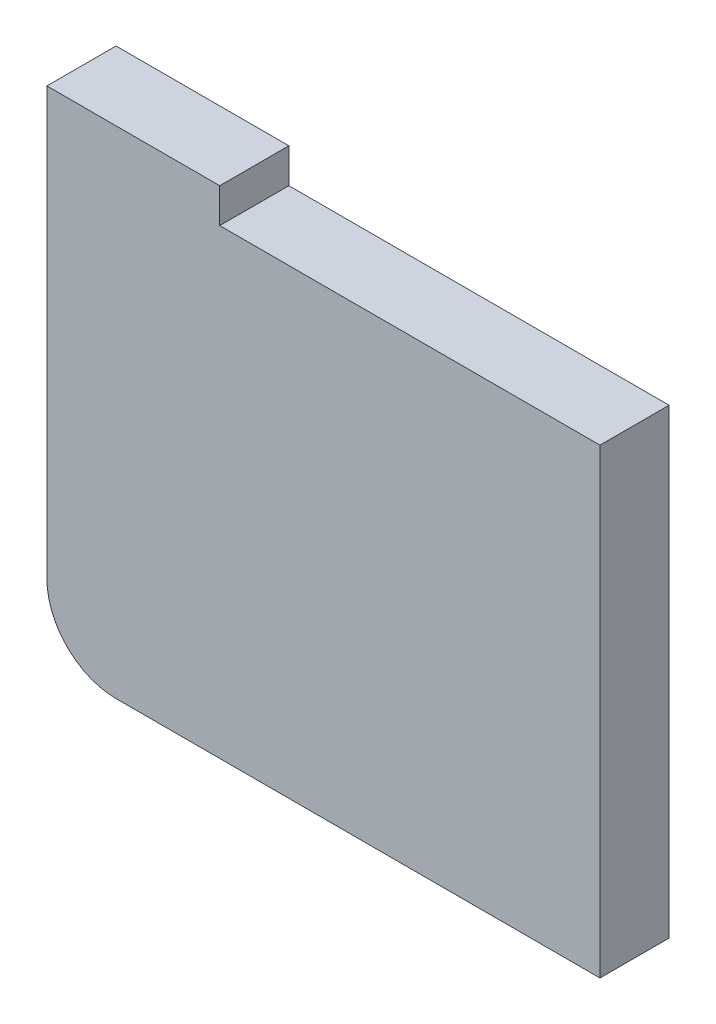
ISO-10303-21;
HEADER;
FILE_DESCRIPTION(('STEP AP214'),'2;1');
FILE_NAME('part.step','',(''),(''),'','','');
FILE_SCHEMA(('AUTOMOTIVE_DESIGN { 1 0 10303 214 1 1 1 1 }'));
ENDSEC;
DATA;
#1=APPLICATION_CONTEXT('core data for automotive mechanical design processes');
#2=APPLICATION_PROTOCOL_DEFINITION('international standard','automotive_design',2000,#1);
#3=PRODUCT_CONTEXT('',#1,'mechanical');
#4=PRODUCT('Part','Part','',(#3));
#5=PRODUCT_RELATED_PRODUCT_CATEGORY('part','',(#4));
#6=PRODUCT_DEFINITION_FORMATION('','',#4);
#7=PRODUCT_DEFINITION_CONTEXT('part definition',#1,'design');
#8=PRODUCT_DEFINITION('design','',#6,#7);
#9=PRODUCT_DEFINITION_SHAPE('','',#8);
#10=(LENGTH_UNIT() NAMED_UNIT(*) SI_UNIT(.MILLI.,.METRE.));
#11=(NAMED_UNIT(*) PLANE_ANGLE_UNIT() SI_UNIT($,.RADIAN.));
#12=(NAMED_UNIT(*) SI_UNIT($,.STERADIAN.) SOLID_ANGLE_UNIT());
#13=UNCERTAINTY_MEASURE_WITH_UNIT(LENGTH_MEASURE(1.E-05),#10,'distance_accuracy_value','');
#14=(GEOMETRIC_REPRESENTATION_CONTEXT(3) GLOBAL_UNCERTAINTY_ASSIGNED_CONTEXT((#13)) GLOBAL_UNIT_ASSIGNED_CONTEXT((#10,
#11,#12)) REPRESENTATION_CONTEXT('',''));
#15=CARTESIAN_POINT('',(0.,0.,0.));
#16=DIRECTION('',(0.,0.,1.));
#17=DIRECTION('',(1.,0.,0.));
#18=AXIS2_PLACEMENT_3D('',#15,#16,#17);
#19=CARTESIAN_POINT('',(-37.821244,0.,2.));
#20=DIRECTION('',(1.,0.,0.));
#21=DIRECTION('',(0.,0.,-1.));
#22=AXIS2_PLACEMENT_3D('',#19,#20,#21);
#23=PLANE('',#22);
#24=DIRECTION('',(0.,-1.,0.));
#25=VECTOR('',#24,1.);
#26=CARTESIAN_POINT('',(-37.821244,0.,0.));
#27=LINE('',#26,#25);
#28=CARTESIAN_POINT('',(-37.821244,6.34999999999999,0.));
#29=VERTEX_POINT('',#28);
#30=CARTESIAN_POINT('',(-37.821244,-5.99999999999999,0.));
#31=VERTEX_POINT('',#30);
#32=EDGE_CURVE('E125',#29,#31,#27,.T.);
#33=ORIENTED_EDGE('',*,*,#32,.T.);
#34=DIRECTION('',(0.,0.,-1.));
#35=VECTOR('',#34,1.);
#36=CARTESIAN_POINT('',(-37.821244,-5.99999999999999,2.));
#37=LINE('',#36,#35);
#38=CARTESIAN_POINT('',(-37.821244,-5.99999999999999,2.));
#39=VERTEX_POINT('',#38);
#40=EDGE_CURVE('E11',#39,#31,#37,.T.);
#41=ORIENTED_EDGE('',*,*,#40,.F.);
#42=DIRECTION('',(0.,-1.,0.));
#43=VECTOR('',#42,1.);
#44=CARTESIAN_POINT('',(-37.821244,0.,2.));
#45=LINE('',#44,#43);
#46=CARTESIAN_POINT('',(-37.821244,6.34999999999999,2.));
#47=VERTEX_POINT('',#46);
#48=EDGE_CURVE('E141',#47,#39,#45,.T.);
#49=ORIENTED_EDGE('',*,*,#48,.F.);
#50=DIRECTION('',(0.,0.,-1.));
#51=VECTOR('',#50,1.);
#52=CARTESIAN_POINT('',(-37.821244,6.34999999999999,2.));
#53=LINE('',#52,#51);
#54=EDGE_CURVE('E51',#47,#29,#53,.T.);
#55=ORIENTED_EDGE('',*,*,#54,.T.);
#56=EDGE_LOOP('',(#33,#41,#49,#55));
#57=FACE_BOUND('',#56,.T.);
#58=ADVANCED_FACE('F35',(#57),#23,.F.);
#59=CARTESIAN_POINT('',(-35.821244,-5.99999999999999,2.));
#60=DIRECTION('',(0.,0.,-1.));
#61=DIRECTION('',(-1.,0.,0.));
#62=AXIS2_PLACEMENT_3D('',#59,#60,#61);
#63=CYLINDRICAL_SURFACE('',#62,2.);
#64=CARTESIAN_POINT('',(-35.821244,-5.99999999999999,0.));
#65=DIRECTION('',(0.,0.,1.));
#66=DIRECTION('',(1.,0.,0.));
#67=AXIS2_PLACEMENT_3D('',#64,#65,#66);
#68=CIRCLE('',#67,2.);
#69=CARTESIAN_POINT('',(-35.821244,-7.99999999999999,0.));
#70=VERTEX_POINT('',#69);
#71=EDGE_CURVE('E127',#31,#70,#68,.T.);
#72=ORIENTED_EDGE('',*,*,#71,.T.);
#73=DIRECTION('',(0.,0.,-1.));
#74=VECTOR('',#73,1.);
#75=CARTESIAN_POINT('',(-35.821244,-7.99999999999999,2.));
#76=LINE('',#75,#74);
#77=CARTESIAN_POINT('',(-35.821244,-7.99999999999999,2.));
#78=VERTEX_POINT('',#77);
#79=EDGE_CURVE('E43',#78,#70,#76,.T.);
#80=ORIENTED_EDGE('',*,*,#79,.F.);
#81=CARTESIAN_POINT('',(-35.821244,-5.99999999999999,2.));
#82=DIRECTION('',(0.,0.,1.));
#83=DIRECTION('',(1.,0.,0.));
#84=AXIS2_PLACEMENT_3D('',#81,#82,#83);
#85=CIRCLE('',#84,2.);
#86=EDGE_CURVE('E86',#39,#78,#85,.T.);
#87=ORIENTED_EDGE('',*,*,#86,.F.);
#88=ORIENTED_EDGE('',*,*,#40,.T.);
#89=EDGE_LOOP('',(#72,#80,#87,#88));
#90=FACE_BOUND('',#89,.T.);
#91=ADVANCED_FACE('F162',(#90),#63,.T.);
#92=CARTESIAN_POINT('',(0.,-7.99999999999999,2.));
#93=DIRECTION('',(0.,1.,0.));
#94=DIRECTION('',(0.,0.,1.));
#95=AXIS2_PLACEMENT_3D('',#92,#93,#94);
#96=PLANE('',#95);
#97=DIRECTION('',(1.,0.,0.));
#98=VECTOR('',#97,1.);
#99=CARTESIAN_POINT('',(0.,-7.99999999999999,0.));
#100=LINE('',#99,#98);
#101=CARTESIAN_POINT('',(-21.821244,-7.99999999999999,0.));
#102=VERTEX_POINT('',#101);
#103=EDGE_CURVE('E129',#70,#102,#100,.T.);
#104=ORIENTED_EDGE('',*,*,#103,.T.);
#105=DIRECTION('',(0.,0.,-1.));
#106=VECTOR('',#105,1.);
#107=CARTESIAN_POINT('',(-21.821244,-7.99999999999999,2.));
#108=LINE('',#107,#106);
#109=CARTESIAN_POINT('',(-21.821244,-7.99999999999999,2.));
#110=VERTEX_POINT('',#109);
#111=EDGE_CURVE('E145',#110,#102,#108,.T.);
#112=ORIENTED_EDGE('',*,*,#111,.F.);
#113=DIRECTION('',(1.,0.,0.));
#114=VECTOR('',#113,1.);
#115=CARTESIAN_POINT('',(0.,-7.99999999999999,2.));
#116=LINE('',#115,#114);
#117=EDGE_CURVE('E152',#78,#110,#116,.T.);
#118=ORIENTED_EDGE('',*,*,#117,.F.);
#119=ORIENTED_EDGE('',*,*,#79,.T.);
#120=EDGE_LOOP('',(#104,#112,#118,#119));
#121=FACE_BOUND('',#120,.T.);
#122=ADVANCED_FACE('F150',(#121),#96,.F.);
#123=CARTESIAN_POINT('',(-21.821244,0.,2.));
#124=DIRECTION('',(1.,0.,0.));
#125=DIRECTION('',(0.,1.,0.));
#126=AXIS2_PLACEMENT_3D('',#123,#124,#125);
#127=PLANE('',#126);
#128=DIRECTION('',(0.,-1.,0.));
#129=VECTOR('',#128,1.);
#130=CARTESIAN_POINT('',(-21.821244,0.,0.));
#131=LINE('',#130,#129);
#132=CARTESIAN_POINT('',(-21.821244,5.34999999999999,0.));
#133=VERTEX_POINT('',#132);
#134=EDGE_CURVE('E132',#133,#102,#131,.T.);
#135=ORIENTED_EDGE('',*,*,#134,.F.);
#136=DIRECTION('',(0.,0.,-1.));
#137=VECTOR('',#136,1.);
#138=CARTESIAN_POINT('',(-21.821244,5.34999999999999,2.));
#139=LINE('',#138,#137);
#140=CARTESIAN_POINT('',(-21.821244,5.34999999999999,2.));
#141=VERTEX_POINT('',#140);
#142=EDGE_CURVE('E108',#141,#133,#139,.T.);
#143=ORIENTED_EDGE('',*,*,#142,.F.);
#144=DIRECTION('',(0.,-1.,0.));
#145=VECTOR('',#144,1.);
#146=CARTESIAN_POINT('',(-21.821244,0.,2.));
#147=LINE('',#146,#145);
#148=EDGE_CURVE('E117',#141,#110,#147,.T.);
#149=ORIENTED_EDGE('',*,*,#148,.T.);
#150=ORIENTED_EDGE('',*,*,#111,.T.);
#151=EDGE_LOOP('',(#135,#143,#149,#150));
#152=FACE_BOUND('',#151,.T.);
#153=ADVANCED_FACE('F157',(#152),#127,.T.);
#154=CARTESIAN_POINT('',(0.,5.34999999999999,2.));
#155=DIRECTION('',(0.,1.,0.));
#156=DIRECTION('',(0.,0.,1.));
#157=AXIS2_PLACEMENT_3D('',#154,#155,#156);
#158=PLANE('',#157);
#159=DIRECTION('',(1.,0.,0.));
#160=VECTOR('',#159,1.);
#161=CARTESIAN_POINT('',(0.,5.34999999999999,0.));
#162=LINE('',#161,#160);
#163=CARTESIAN_POINT('',(-32.821244,5.34999999999999,0.));
#164=VERTEX_POINT('',#163);
#165=EDGE_CURVE('E104',#164,#133,#162,.T.);
#166=ORIENTED_EDGE('',*,*,#165,.F.);
#167=DIRECTION('',(0.,0.,-1.));
#168=VECTOR('',#167,1.);
#169=CARTESIAN_POINT('',(-32.821244,5.34999999999999,2.));
#170=LINE('',#169,#168);
#171=CARTESIAN_POINT('',(-32.821244,5.34999999999999,2.));
#172=VERTEX_POINT('',#171);
#173=EDGE_CURVE('E99',#172,#164,#170,.T.);
#174=ORIENTED_EDGE('',*,*,#173,.F.);
#175=DIRECTION('',(1.,0.,0.));
#176=VECTOR('',#175,1.);
#177=CARTESIAN_POINT('',(0.,5.34999999999999,2.));
#178=LINE('',#177,#176);
#179=EDGE_CURVE('E102',#172,#141,#178,.T.);
#180=ORIENTED_EDGE('',*,*,#179,.T.);
#181=ORIENTED_EDGE('',*,*,#142,.T.);
#182=EDGE_LOOP('',(#166,#174,#180,#181));
#183=FACE_BOUND('',#182,.T.);
#184=ADVANCED_FACE('F101',(#183),#158,.T.);
#185=CARTESIAN_POINT('',(-32.821244,0.,2.));
#186=DIRECTION('',(1.,0.,0.));
#187=DIRECTION('',(0.,0.,-1.));
#188=AXIS2_PLACEMENT_3D('',#185,#186,#187);
#189=PLANE('',#188);
#190=DIRECTION('',(0.,-1.,0.));
#191=VECTOR('',#190,1.);
#192=CARTESIAN_POINT('',(-32.821244,0.,0.));
#193=LINE('',#192,#191);
#194=CARTESIAN_POINT('',(-32.821244,6.34999999999999,0.));
#195=VERTEX_POINT('',#194);
#196=EDGE_CURVE('E136',#195,#164,#193,.T.);
#197=ORIENTED_EDGE('',*,*,#196,.F.);
#198=DIRECTION('',(0.,0.,-1.));
#199=VECTOR('',#198,1.);
#200=CARTESIAN_POINT('',(-32.821244,6.34999999999999,2.));
#201=LINE('',#200,#199);
#202=CARTESIAN_POINT('',(-32.821244,6.34999999999999,2.));
#203=VERTEX_POINT('',#202);
#204=EDGE_CURVE('E74',#203,#195,#201,.T.);
#205=ORIENTED_EDGE('',*,*,#204,.F.);
#206=DIRECTION('',(0.,-1.,0.));
#207=VECTOR('',#206,1.);
#208=CARTESIAN_POINT('',(-32.821244,0.,2.));
#209=LINE('',#208,#207);
#210=EDGE_CURVE('E115',#203,#172,#209,.T.);
#211=ORIENTED_EDGE('',*,*,#210,.T.);
#212=ORIENTED_EDGE('',*,*,#173,.T.);
#213=EDGE_LOOP('',(#197,#205,#211,#212));
#214=FACE_BOUND('',#213,.T.);
#215=ADVANCED_FACE('F119',(#214),#189,.T.);
#216=CARTESIAN_POINT('',(0.,6.34999999999999,2.));
#217=DIRECTION('',(0.,1.,0.));
#218=DIRECTION('',(0.,0.,1.));
#219=AXIS2_PLACEMENT_3D('',#216,#217,#218);
#220=PLANE('',#219);
#221=DIRECTION('',(1.,0.,0.));
#222=VECTOR('',#221,1.);
#223=CARTESIAN_POINT('',(0.,6.34999999999999,0.));
#224=LINE('',#223,#222);
#225=EDGE_CURVE('E138',#29,#195,#224,.T.);
#226=ORIENTED_EDGE('',*,*,#225,.F.);
#227=ORIENTED_EDGE('',*,*,#54,.F.);
#228=DIRECTION('',(1.,0.,0.));
#229=VECTOR('',#228,1.);
#230=CARTESIAN_POINT('',(0.,6.34999999999999,2.));
#231=LINE('',#230,#229);
#232=EDGE_CURVE('E120',#47,#203,#231,.T.);
#233=ORIENTED_EDGE('',*,*,#232,.T.);
#234=ORIENTED_EDGE('',*,*,#204,.T.);
#235=EDGE_LOOP('',(#226,#227,#233,#234));
#236=FACE_BOUND('',#235,.T.);
#237=ADVANCED_FACE('F176',(#236),#220,.T.);
#238=CARTESIAN_POINT('',(0.,0.,2.));
#239=DIRECTION('',(0.,0.,1.));
#240=DIRECTION('',(1.,0.,0.));
#241=AXIS2_PLACEMENT_3D('',#238,#239,#240);
#242=PLANE('',#241);
#243=ORIENTED_EDGE('',*,*,#48,.T.);
#244=ORIENTED_EDGE('',*,*,#86,.T.);
#245=ORIENTED_EDGE('',*,*,#117,.T.);
#246=ORIENTED_EDGE('',*,*,#148,.F.);
#247=ORIENTED_EDGE('',*,*,#179,.F.);
#248=ORIENTED_EDGE('',*,*,#210,.F.);
#249=ORIENTED_EDGE('',*,*,#232,.F.);
#250=EDGE_LOOP('',(#243,#244,#245,#246,#247,#248,#249));
#251=FACE_BOUND('',#250,.T.);
#252=ADVANCED_FACE('F113',(#251),#242,.T.);
#253=CARTESIAN_POINT('',(0.,0.,0.));
#254=DIRECTION('',(0.,0.,1.));
#255=DIRECTION('',(1.,0.,0.));
#256=AXIS2_PLACEMENT_3D('',#253,#254,#255);
#257=PLANE('',#256);
#258=ORIENTED_EDGE('',*,*,#32,.F.);
#259=ORIENTED_EDGE('',*,*,#225,.T.);
#260=ORIENTED_EDGE('',*,*,#196,.T.);
#261=ORIENTED_EDGE('',*,*,#165,.T.);
#262=ORIENTED_EDGE('',*,*,#134,.T.);
#263=ORIENTED_EDGE('',*,*,#103,.F.);
#264=ORIENTED_EDGE('',*,*,#71,.F.);
#265=EDGE_LOOP('',(#258,#259,#260,#261,#262,#263,#264));
#266=FACE_BOUND('',#265,.T.);
#267=ADVANCED_FACE('F154',(#266),#257,.F.);
#268=CLOSED_SHELL('',(#58,#91,#122,#153,#184,#215,#237,#252,#267));
#269=MANIFOLD_SOLID_BREP('B2',#268);
#270=ADVANCED_BREP_SHAPE_REPRESENTATION('',(#18,#269),#14);
#271=SHAPE_DEFINITION_REPRESENTATION(#9,#270);
ENDSEC;
END-ISO-10303-21;
